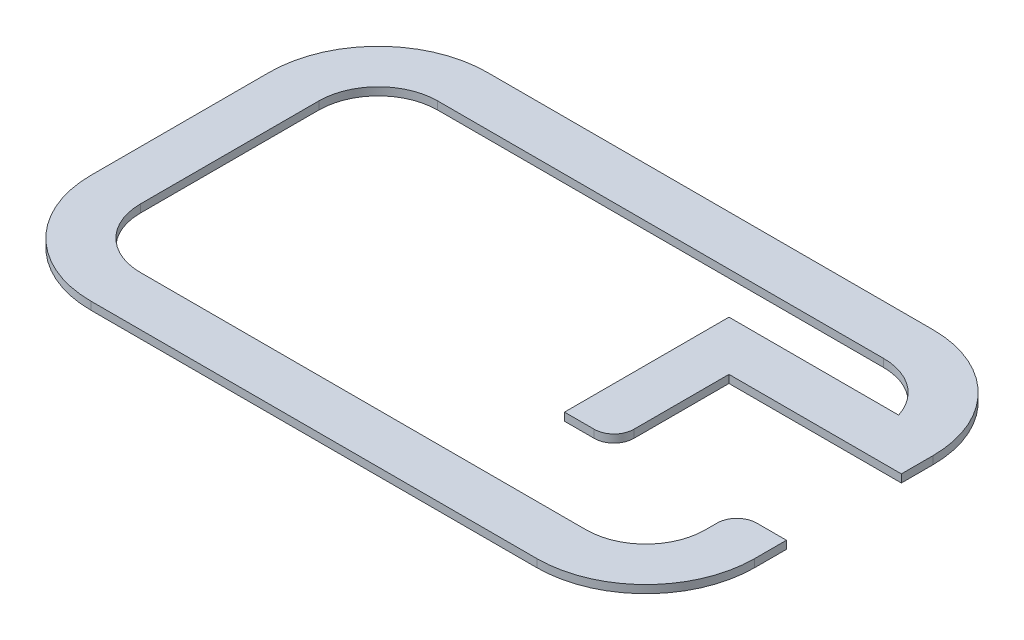
ISO-10303-21;
HEADER;
FILE_DESCRIPTION(('STEP AP214'),'2;1');
FILE_NAME('part.step','',(''),(''),'','','');
FILE_SCHEMA(('AUTOMOTIVE_DESIGN { 1 0 10303 214 1 1 1 1 }'));
ENDSEC;
DATA;
#1=APPLICATION_CONTEXT('core data for automotive mechanical design processes');
#2=APPLICATION_PROTOCOL_DEFINITION('international standard','automotive_design',2000,#1);
#3=PRODUCT_CONTEXT('',#1,'mechanical');
#4=PRODUCT('Part','Part','',(#3));
#5=PRODUCT_RELATED_PRODUCT_CATEGORY('part','',(#4));
#6=PRODUCT_DEFINITION_FORMATION('','',#4);
#7=PRODUCT_DEFINITION_CONTEXT('part definition',#1,'design');
#8=PRODUCT_DEFINITION('design','',#6,#7);
#9=PRODUCT_DEFINITION_SHAPE('','',#8);
#10=(LENGTH_UNIT() NAMED_UNIT(*) SI_UNIT(.MILLI.,.METRE.));
#11=(NAMED_UNIT(*) PLANE_ANGLE_UNIT() SI_UNIT($,.RADIAN.));
#12=(NAMED_UNIT(*) SI_UNIT($,.STERADIAN.) SOLID_ANGLE_UNIT());
#13=UNCERTAINTY_MEASURE_WITH_UNIT(LENGTH_MEASURE(1.E-05),#10,'distance_accuracy_value','');
#14=(GEOMETRIC_REPRESENTATION_CONTEXT(3) GLOBAL_UNCERTAINTY_ASSIGNED_CONTEXT((#13)) GLOBAL_UNIT_ASSIGNED_CONTEXT((#10,
#11,#12)) REPRESENTATION_CONTEXT('',''));
#15=CARTESIAN_POINT('',(0.,0.,0.));
#16=DIRECTION('',(0.,0.,1.));
#17=DIRECTION('',(1.,0.,0.));
#18=AXIS2_PLACEMENT_3D('',#15,#16,#17);
#19=CARTESIAN_POINT('',(55.,4.,-55.));
#20=DIRECTION('',(0.,-1.,0.));
#21=DIRECTION('',(0.,0.,-1.));
#22=AXIS2_PLACEMENT_3D('',#19,#20,#21);
#23=CYLINDRICAL_SURFACE('',#22,55.);
#24=CARTESIAN_POINT('',(55.,0.,-55.));
#25=DIRECTION('',(0.,1.,0.));
#26=DIRECTION('',(0.,0.,-1.));
#27=AXIS2_PLACEMENT_3D('',#24,#25,#26);
#28=CIRCLE('',#27,55.);
#29=CARTESIAN_POINT('',(0.,0.,-55.0000000000004));
#30=VERTEX_POINT('',#29);
#31=CARTESIAN_POINT('',(55.0000000000004,0.,0.));
#32=VERTEX_POINT('',#31);
#33=EDGE_CURVE('E230',#30,#32,#28,.T.);
#34=ORIENTED_EDGE('',*,*,#33,.T.);
#35=DIRECTION('',(0.,-1.,0.));
#36=VECTOR('',#35,1.);
#37=CARTESIAN_POINT('',(55.0000000000004,4.,0.));
#38=LINE('',#37,#36);
#39=CARTESIAN_POINT('',(55.0000000000004,4.,0.));
#40=VERTEX_POINT('',#39);
#41=EDGE_CURVE('E11',#40,#32,#38,.T.);
#42=ORIENTED_EDGE('',*,*,#41,.F.);
#43=CARTESIAN_POINT('',(55.,4.,-55.));
#44=DIRECTION('',(0.,1.,0.));
#45=DIRECTION('',(0.,0.,-1.));
#46=AXIS2_PLACEMENT_3D('',#43,#44,#45);
#47=CIRCLE('',#46,55.);
#48=CARTESIAN_POINT('',(0.,4.,-55.0000000000004));
#49=VERTEX_POINT('',#48);
#50=EDGE_CURVE('E278',#49,#40,#47,.T.);
#51=ORIENTED_EDGE('',*,*,#50,.F.);
#52=DIRECTION('',(0.,-1.,0.));
#53=VECTOR('',#52,1.);
#54=CARTESIAN_POINT('',(0.,4.,-55.0000000000004));
#55=LINE('',#54,#53);
#56=EDGE_CURVE('E226',#49,#30,#55,.T.);
#57=ORIENTED_EDGE('',*,*,#56,.T.);
#58=EDGE_LOOP('',(#34,#42,#51,#57));
#59=FACE_BOUND('',#58,.T.);
#60=ADVANCED_FACE('F32',(#59),#23,.T.);
#61=CARTESIAN_POINT('',(55.0000000000004,4.,0.));
#62=DIRECTION('',(0.,0.,-1.));
#63=DIRECTION('',(-1.,0.,0.));
#64=AXIS2_PLACEMENT_3D('',#61,#62,#63);
#65=PLANE('',#64);
#66=DIRECTION('',(1.,0.,0.));
#67=VECTOR('',#66,1.);
#68=CARTESIAN_POINT('',(55.0000000000004,0.,0.));
#69=LINE('',#68,#67);
#70=CARTESIAN_POINT('',(280.,0.,0.));
#71=VERTEX_POINT('',#70);
#72=EDGE_CURVE('E233',#32,#71,#69,.T.);
#73=ORIENTED_EDGE('',*,*,#72,.T.);
#74=DIRECTION('',(0.,-1.,0.));
#75=VECTOR('',#74,1.);
#76=CARTESIAN_POINT('',(280.,4.,0.));
#77=LINE('',#76,#75);
#78=CARTESIAN_POINT('',(280.,4.,0.));
#79=VERTEX_POINT('',#78);
#80=EDGE_CURVE('E40',#79,#71,#77,.T.);
#81=ORIENTED_EDGE('',*,*,#80,.F.);
#82=DIRECTION('',(1.,0.,0.));
#83=VECTOR('',#82,1.);
#84=CARTESIAN_POINT('',(55.0000000000004,4.,0.));
#85=LINE('',#84,#83);
#86=EDGE_CURVE('E142',#40,#79,#85,.T.);
#87=ORIENTED_EDGE('',*,*,#86,.F.);
#88=ORIENTED_EDGE('',*,*,#41,.T.);
#89=EDGE_LOOP('',(#73,#81,#87,#88));
#90=FACE_BOUND('',#89,.T.);
#91=ADVANCED_FACE('F421',(#90),#65,.F.);
#92=CARTESIAN_POINT('',(280.,4.,-55.));
#93=DIRECTION('',(0.,-1.,0.));
#94=DIRECTION('',(0.,0.,-1.));
#95=AXIS2_PLACEMENT_3D('',#92,#93,#94);
#96=CYLINDRICAL_SURFACE('',#95,55.);
#97=CARTESIAN_POINT('',(280.,0.,-55.));
#98=DIRECTION('',(0.,1.,0.));
#99=DIRECTION('',(0.,0.,1.));
#100=AXIS2_PLACEMENT_3D('',#97,#98,#99);
#101=CIRCLE('',#100,55.);
#102=CARTESIAN_POINT('',(335.,0.,-55.0000000000004));
#103=VERTEX_POINT('',#102);
#104=EDGE_CURVE('E235',#71,#103,#101,.T.);
#105=ORIENTED_EDGE('',*,*,#104,.T.);
#106=DIRECTION('',(0.,-1.,0.));
#107=VECTOR('',#106,1.);
#108=CARTESIAN_POINT('',(335.,4.,-55.0000000000004));
#109=LINE('',#108,#107);
#110=CARTESIAN_POINT('',(335.,4.,-55.0000000000004));
#111=VERTEX_POINT('',#110);
#112=EDGE_CURVE('E336',#111,#103,#109,.T.);
#113=ORIENTED_EDGE('',*,*,#112,.F.);
#114=CARTESIAN_POINT('',(280.,4.,-55.));
#115=DIRECTION('',(0.,1.,0.));
#116=DIRECTION('',(0.,0.,1.));
#117=AXIS2_PLACEMENT_3D('',#114,#115,#116);
#118=CIRCLE('',#117,55.);
#119=EDGE_CURVE('E344',#79,#111,#118,.T.);
#120=ORIENTED_EDGE('',*,*,#119,.F.);
#121=ORIENTED_EDGE('',*,*,#80,.T.);
#122=EDGE_LOOP('',(#105,#113,#120,#121));
#123=FACE_BOUND('',#122,.T.);
#124=ADVANCED_FACE('F342',(#123),#96,.T.);
#125=CARTESIAN_POINT('',(335.,4.,-55.0000000000004));
#126=DIRECTION('',(-1.,0.,0.));
#127=DIRECTION('',(0.,0.,1.));
#128=AXIS2_PLACEMENT_3D('',#125,#126,#127);
#129=PLANE('',#128);
#130=DIRECTION('',(0.,0.,-1.));
#131=VECTOR('',#130,1.);
#132=CARTESIAN_POINT('',(335.,0.,-55.0000000000004));
#133=LINE('',#132,#131);
#134=CARTESIAN_POINT('',(335.,0.,-71.));
#135=VERTEX_POINT('',#134);
#136=EDGE_CURVE('E237',#103,#135,#133,.T.);
#137=ORIENTED_EDGE('',*,*,#136,.T.);
#138=DIRECTION('',(0.,-1.,0.));
#139=VECTOR('',#138,1.);
#140=CARTESIAN_POINT('',(335.,4.,-71.));
#141=LINE('',#140,#139);
#142=CARTESIAN_POINT('',(335.,4.,-71.));
#143=VERTEX_POINT('',#142);
#144=EDGE_CURVE('E333',#143,#135,#141,.T.);
#145=ORIENTED_EDGE('',*,*,#144,.F.);
#146=DIRECTION('',(0.,0.,-1.));
#147=VECTOR('',#146,1.);
#148=CARTESIAN_POINT('',(335.,4.,-55.0000000000004));
#149=LINE('',#148,#147);
#150=EDGE_CURVE('E362',#111,#143,#149,.T.);
#151=ORIENTED_EDGE('',*,*,#150,.F.);
#152=ORIENTED_EDGE('',*,*,#112,.T.);
#153=EDGE_LOOP('',(#137,#145,#151,#152));
#154=FACE_BOUND('',#153,.T.);
#155=ADVANCED_FACE('F353',(#154),#129,.F.);
#156=CARTESIAN_POINT('',(320.,4.,-71.));
#157=DIRECTION('',(0.,0.,1.));
#158=DIRECTION('',(1.,0.,0.));
#159=AXIS2_PLACEMENT_3D('',#156,#157,#158);
#160=PLANE('',#159);
#161=DIRECTION('',(-1.,0.,0.));
#162=VECTOR('',#161,1.);
#163=CARTESIAN_POINT('',(320.,0.,-71.));
#164=LINE('',#163,#162);
#165=CARTESIAN_POINT('',(320.,0.,-71.));
#166=VERTEX_POINT('',#165);
#167=EDGE_CURVE('E239',#135,#166,#164,.T.);
#168=ORIENTED_EDGE('',*,*,#167,.T.);
#169=DIRECTION('',(0.,-1.,0.));
#170=VECTOR('',#169,1.);
#171=CARTESIAN_POINT('',(320.,4.,-71.));
#172=LINE('',#171,#170);
#173=CARTESIAN_POINT('',(320.,4.,-71.));
#174=VERTEX_POINT('',#173);
#175=EDGE_CURVE('E330',#174,#166,#172,.T.);
#176=ORIENTED_EDGE('',*,*,#175,.F.);
#177=DIRECTION('',(-1.,0.,0.));
#178=VECTOR('',#177,1.);
#179=CARTESIAN_POINT('',(320.,4.,-71.));
#180=LINE('',#179,#178);
#181=EDGE_CURVE('E359',#143,#174,#180,.T.);
#182=ORIENTED_EDGE('',*,*,#181,.F.);
#183=ORIENTED_EDGE('',*,*,#144,.T.);
#184=EDGE_LOOP('',(#168,#176,#182,#183));
#185=FACE_BOUND('',#184,.T.);
#186=ADVANCED_FACE('F357',(#185),#160,.F.);
#187=CARTESIAN_POINT('',(320.,4.,-61.));
#188=DIRECTION('',(0.,-1.,0.));
#189=DIRECTION('',(0.,0.,-1.));
#190=AXIS2_PLACEMENT_3D('',#187,#188,#189);
#191=CYLINDRICAL_SURFACE('',#190,10.);
#192=CARTESIAN_POINT('',(320.,0.,-61.));
#193=DIRECTION('',(0.,1.,0.));
#194=DIRECTION('',(0.,0.,-1.));
#195=AXIS2_PLACEMENT_3D('',#192,#193,#194);
#196=CIRCLE('',#195,10.);
#197=CARTESIAN_POINT('',(310.,0.,-60.9999999999999));
#198=VERTEX_POINT('',#197);
#199=EDGE_CURVE('E241',#166,#198,#196,.T.);
#200=ORIENTED_EDGE('',*,*,#199,.T.);
#201=DIRECTION('',(0.,-1.,0.));
#202=VECTOR('',#201,1.);
#203=CARTESIAN_POINT('',(310.,4.,-60.9999999999999));
#204=LINE('',#203,#202);
#205=CARTESIAN_POINT('',(310.,4.,-60.9999999999999));
#206=VERTEX_POINT('',#205);
#207=EDGE_CURVE('E327',#206,#198,#204,.T.);
#208=ORIENTED_EDGE('',*,*,#207,.F.);
#209=CARTESIAN_POINT('',(320.,4.,-61.));
#210=DIRECTION('',(0.,1.,0.));
#211=DIRECTION('',(0.,0.,-1.));
#212=AXIS2_PLACEMENT_3D('',#209,#210,#211);
#213=CIRCLE('',#212,10.);
#214=EDGE_CURVE('E361',#174,#206,#213,.T.);
#215=ORIENTED_EDGE('',*,*,#214,.F.);
#216=ORIENTED_EDGE('',*,*,#175,.T.);
#217=EDGE_LOOP('',(#200,#208,#215,#216));
#218=FACE_BOUND('',#217,.T.);
#219=ADVANCED_FACE('F434',(#218),#191,.T.);
#220=CARTESIAN_POINT('',(310.,4.,-55.0000000000002));
#221=DIRECTION('',(1.,0.,0.));
#222=DIRECTION('',(0.,0.,-1.));
#223=AXIS2_PLACEMENT_3D('',#220,#221,#222);
#224=PLANE('',#223);
#225=DIRECTION('',(0.,0.,1.));
#226=VECTOR('',#225,1.);
#227=CARTESIAN_POINT('',(310.,0.,-55.0000000000002));
#228=LINE('',#227,#226);
#229=CARTESIAN_POINT('',(310.,0.,-55.0000000000002));
#230=VERTEX_POINT('',#229);
#231=EDGE_CURVE('E243',#198,#230,#228,.T.);
#232=ORIENTED_EDGE('',*,*,#231,.T.);
#233=DIRECTION('',(0.,-1.,0.));
#234=VECTOR('',#233,1.);
#235=CARTESIAN_POINT('',(310.,4.,-55.0000000000002));
#236=LINE('',#235,#234);
#237=CARTESIAN_POINT('',(310.,4.,-55.0000000000002));
#238=VERTEX_POINT('',#237);
#239=EDGE_CURVE('E324',#238,#230,#236,.T.);
#240=ORIENTED_EDGE('',*,*,#239,.F.);
#241=DIRECTION('',(0.,0.,1.));
#242=VECTOR('',#241,1.);
#243=CARTESIAN_POINT('',(310.,4.,-55.0000000000002));
#244=LINE('',#243,#242);
#245=EDGE_CURVE('E364',#206,#238,#244,.T.);
#246=ORIENTED_EDGE('',*,*,#245,.F.);
#247=ORIENTED_EDGE('',*,*,#207,.T.);
#248=EDGE_LOOP('',(#232,#240,#246,#247));
#249=FACE_BOUND('',#248,.T.);
#250=ADVANCED_FACE('F437',(#249),#224,.F.);
#251=CARTESIAN_POINT('',(280.,4.,-55.));
#252=DIRECTION('',(0.,-1.,0.));
#253=DIRECTION('',(0.,0.,-1.));
#254=AXIS2_PLACEMENT_3D('',#251,#252,#253);
#255=CYLINDRICAL_SURFACE('',#254,30.);
#256=CARTESIAN_POINT('',(280.,0.,-55.));
#257=DIRECTION('',(0.,-1.,0.));
#258=DIRECTION('',(0.,0.,1.));
#259=AXIS2_PLACEMENT_3D('',#256,#257,#258);
#260=CIRCLE('',#259,30.);
#261=CARTESIAN_POINT('',(280.,0.,-25.));
#262=VERTEX_POINT('',#261);
#263=EDGE_CURVE('E245',#230,#262,#260,.T.);
#264=ORIENTED_EDGE('',*,*,#263,.T.);
#265=DIRECTION('',(0.,-1.,0.));
#266=VECTOR('',#265,1.);
#267=CARTESIAN_POINT('',(280.,4.,-25.));
#268=LINE('',#267,#266);
#269=CARTESIAN_POINT('',(280.,4.,-25.));
#270=VERTEX_POINT('',#269);
#271=EDGE_CURVE('E321',#270,#262,#268,.T.);
#272=ORIENTED_EDGE('',*,*,#271,.F.);
#273=CARTESIAN_POINT('',(280.,4.,-55.));
#274=DIRECTION('',(0.,-1.,0.));
#275=DIRECTION('',(0.,0.,1.));
#276=AXIS2_PLACEMENT_3D('',#273,#274,#275);
#277=CIRCLE('',#276,30.);
#278=EDGE_CURVE('E370',#238,#270,#277,.T.);
#279=ORIENTED_EDGE('',*,*,#278,.F.);
#280=ORIENTED_EDGE('',*,*,#239,.T.);
#281=EDGE_LOOP('',(#264,#272,#279,#280));
#282=FACE_BOUND('',#281,.T.);
#283=ADVANCED_FACE('F441',(#282),#255,.F.);
#284=CARTESIAN_POINT('',(55.0000000000002,4.,-25.));
#285=DIRECTION('',(0.,0.,1.));
#286=DIRECTION('',(1.,0.,0.));
#287=AXIS2_PLACEMENT_3D('',#284,#285,#286);
#288=PLANE('',#287);
#289=DIRECTION('',(-1.,0.,0.));
#290=VECTOR('',#289,1.);
#291=CARTESIAN_POINT('',(55.0000000000002,0.,-25.));
#292=LINE('',#291,#290);
#293=CARTESIAN_POINT('',(55.0000000000002,0.,-25.));
#294=VERTEX_POINT('',#293);
#295=EDGE_CURVE('E247',#262,#294,#292,.T.);
#296=ORIENTED_EDGE('',*,*,#295,.T.);
#297=DIRECTION('',(0.,-1.,0.));
#298=VECTOR('',#297,1.);
#299=CARTESIAN_POINT('',(55.0000000000002,4.,-25.));
#300=LINE('',#299,#298);
#301=CARTESIAN_POINT('',(55.0000000000002,4.,-25.));
#302=VERTEX_POINT('',#301);
#303=EDGE_CURVE('E318',#302,#294,#300,.T.);
#304=ORIENTED_EDGE('',*,*,#303,.F.);
#305=DIRECTION('',(-1.,0.,0.));
#306=VECTOR('',#305,1.);
#307=CARTESIAN_POINT('',(55.0000000000002,4.,-25.));
#308=LINE('',#307,#306);
#309=EDGE_CURVE('E372',#270,#302,#308,.T.);
#310=ORIENTED_EDGE('',*,*,#309,.F.);
#311=ORIENTED_EDGE('',*,*,#271,.T.);
#312=EDGE_LOOP('',(#296,#304,#310,#311));
#313=FACE_BOUND('',#312,.T.);
#314=ADVANCED_FACE('F445',(#313),#288,.F.);
#315=CARTESIAN_POINT('',(55.,4.,-55.));
#316=DIRECTION('',(0.,-1.,0.));
#317=DIRECTION('',(0.,0.,-1.));
#318=AXIS2_PLACEMENT_3D('',#315,#316,#317);
#319=CYLINDRICAL_SURFACE('',#318,30.);
#320=CARTESIAN_POINT('',(55.,0.,-55.));
#321=DIRECTION('',(0.,-1.,0.));
#322=DIRECTION('',(0.,0.,-1.));
#323=AXIS2_PLACEMENT_3D('',#320,#321,#322);
#324=CIRCLE('',#323,30.);
#325=CARTESIAN_POINT('',(25.,0.,-55.0000000000004));
#326=VERTEX_POINT('',#325);
#327=EDGE_CURVE('E249',#294,#326,#324,.T.);
#328=ORIENTED_EDGE('',*,*,#327,.T.);
#329=DIRECTION('',(0.,-1.,0.));
#330=VECTOR('',#329,1.);
#331=CARTESIAN_POINT('',(25.,4.,-55.0000000000004));
#332=LINE('',#331,#330);
#333=CARTESIAN_POINT('',(25.,4.,-55.0000000000004));
#334=VERTEX_POINT('',#333);
#335=EDGE_CURVE('E315',#334,#326,#332,.T.);
#336=ORIENTED_EDGE('',*,*,#335,.F.);
#337=CARTESIAN_POINT('',(55.,4.,-55.));
#338=DIRECTION('',(0.,-1.,0.));
#339=DIRECTION('',(0.,0.,-1.));
#340=AXIS2_PLACEMENT_3D('',#337,#338,#339);
#341=CIRCLE('',#340,30.);
#342=EDGE_CURVE('E374',#302,#334,#341,.T.);
#343=ORIENTED_EDGE('',*,*,#342,.F.);
#344=ORIENTED_EDGE('',*,*,#303,.T.);
#345=EDGE_LOOP('',(#328,#336,#343,#344));
#346=FACE_BOUND('',#345,.T.);
#347=ADVANCED_FACE('F449',(#346),#319,.F.);
#348=CARTESIAN_POINT('',(25.,4.,-55.0000000000004));
#349=DIRECTION('',(-1.,0.,0.));
#350=DIRECTION('',(0.,0.,1.));
#351=AXIS2_PLACEMENT_3D('',#348,#349,#350);
#352=PLANE('',#351);
#353=DIRECTION('',(0.,0.,-1.));
#354=VECTOR('',#353,1.);
#355=CARTESIAN_POINT('',(25.,0.,-55.0000000000004));
#356=LINE('',#355,#354);
#357=CARTESIAN_POINT('',(25.,0.,-145.));
#358=VERTEX_POINT('',#357);
#359=EDGE_CURVE('E251',#326,#358,#356,.T.);
#360=ORIENTED_EDGE('',*,*,#359,.T.);
#361=DIRECTION('',(0.,-1.,0.));
#362=VECTOR('',#361,1.);
#363=CARTESIAN_POINT('',(25.,4.,-145.));
#364=LINE('',#363,#362);
#365=CARTESIAN_POINT('',(25.,4.,-145.));
#366=VERTEX_POINT('',#365);
#367=EDGE_CURVE('E312',#366,#358,#364,.T.);
#368=ORIENTED_EDGE('',*,*,#367,.F.);
#369=DIRECTION('',(0.,0.,-1.));
#370=VECTOR('',#369,1.);
#371=CARTESIAN_POINT('',(25.,4.,-55.0000000000004));
#372=LINE('',#371,#370);
#373=EDGE_CURVE('E376',#334,#366,#372,.T.);
#374=ORIENTED_EDGE('',*,*,#373,.F.);
#375=ORIENTED_EDGE('',*,*,#335,.T.);
#376=EDGE_LOOP('',(#360,#368,#374,#375));
#377=FACE_BOUND('',#376,.T.);
#378=ADVANCED_FACE('F453',(#377),#352,.F.);
#379=CARTESIAN_POINT('',(55.,4.,-145.));
#380=DIRECTION('',(0.,-1.,0.));
#381=DIRECTION('',(0.,0.,-1.));
#382=AXIS2_PLACEMENT_3D('',#379,#380,#381);
#383=CYLINDRICAL_SURFACE('',#382,30.);
#384=CARTESIAN_POINT('',(55.,0.,-145.));
#385=DIRECTION('',(0.,-1.,0.));
#386=DIRECTION('',(0.,0.,-1.));
#387=AXIS2_PLACEMENT_3D('',#384,#385,#386);
#388=CIRCLE('',#387,30.);
#389=CARTESIAN_POINT('',(55.,0.,-175.));
#390=VERTEX_POINT('',#389);
#391=EDGE_CURVE('E253',#358,#390,#388,.T.);
#392=ORIENTED_EDGE('',*,*,#391,.T.);
#393=DIRECTION('',(0.,-1.,0.));
#394=VECTOR('',#393,1.);
#395=CARTESIAN_POINT('',(55.,4.,-175.));
#396=LINE('',#395,#394);
#397=CARTESIAN_POINT('',(55.,4.,-175.));
#398=VERTEX_POINT('',#397);
#399=EDGE_CURVE('E309',#398,#390,#396,.T.);
#400=ORIENTED_EDGE('',*,*,#399,.F.);
#401=CARTESIAN_POINT('',(55.,4.,-145.));
#402=DIRECTION('',(0.,-1.,0.));
#403=DIRECTION('',(0.,0.,-1.));
#404=AXIS2_PLACEMENT_3D('',#401,#402,#403);
#405=CIRCLE('',#404,30.);
#406=EDGE_CURVE('E378',#366,#398,#405,.T.);
#407=ORIENTED_EDGE('',*,*,#406,.F.);
#408=ORIENTED_EDGE('',*,*,#367,.T.);
#409=EDGE_LOOP('',(#392,#400,#407,#408));
#410=FACE_BOUND('',#409,.T.);
#411=ADVANCED_FACE('F457',(#410),#383,.F.);
#412=CARTESIAN_POINT('',(55.0000000000004,4.,-175.));
#413=DIRECTION('',(0.,0.,-1.));
#414=DIRECTION('',(-1.,0.,0.));
#415=AXIS2_PLACEMENT_3D('',#412,#413,#414);
#416=PLANE('',#415);
#417=DIRECTION('',(1.,0.,0.));
#418=VECTOR('',#417,1.);
#419=CARTESIAN_POINT('',(55.0000000000004,0.,-175.));
#420=LINE('',#419,#418);
#421=CARTESIAN_POINT('',(280.,0.,-175.));
#422=VERTEX_POINT('',#421);
#423=EDGE_CURVE('E255',#390,#422,#420,.T.);
#424=ORIENTED_EDGE('',*,*,#423,.T.);
#425=DIRECTION('',(0.,-1.,0.));
#426=VECTOR('',#425,1.);
#427=CARTESIAN_POINT('',(280.,4.,-175.));
#428=LINE('',#427,#426);
#429=CARTESIAN_POINT('',(280.,4.,-175.));
#430=VERTEX_POINT('',#429);
#431=EDGE_CURVE('E306',#430,#422,#428,.T.);
#432=ORIENTED_EDGE('',*,*,#431,.F.);
#433=DIRECTION('',(1.,0.,0.));
#434=VECTOR('',#433,1.);
#435=CARTESIAN_POINT('',(55.0000000000004,4.,-175.));
#436=LINE('',#435,#434);
#437=EDGE_CURVE('E380',#398,#430,#436,.T.);
#438=ORIENTED_EDGE('',*,*,#437,.F.);
#439=ORIENTED_EDGE('',*,*,#399,.T.);
#440=EDGE_LOOP('',(#424,#432,#438,#439));
#441=FACE_BOUND('',#440,.T.);
#442=ADVANCED_FACE('F461',(#441),#416,.F.);
#443=CARTESIAN_POINT('',(280.,4.,-145.));
#444=DIRECTION('',(0.,-1.,0.));
#445=DIRECTION('',(0.,0.,-1.));
#446=AXIS2_PLACEMENT_3D('',#443,#444,#445);
#447=CYLINDRICAL_SURFACE('',#446,30.);
#448=CARTESIAN_POINT('',(280.,0.,-145.));
#449=DIRECTION('',(0.,-1.,0.));
#450=DIRECTION('',(0.,0.,-1.));
#451=AXIS2_PLACEMENT_3D('',#448,#449,#450);
#452=CIRCLE('',#451,30.);
#453=CARTESIAN_POINT('',(308.618176042508,0.,-154.));
#454=VERTEX_POINT('',#453);
#455=EDGE_CURVE('E257',#422,#454,#452,.T.);
#456=ORIENTED_EDGE('',*,*,#455,.T.);
#457=DIRECTION('',(0.,-1.,0.));
#458=VECTOR('',#457,1.);
#459=CARTESIAN_POINT('',(308.618176042508,4.,-154.));
#460=LINE('',#459,#458);
#461=CARTESIAN_POINT('',(308.618176042508,4.,-154.));
#462=VERTEX_POINT('',#461);
#463=EDGE_CURVE('E303',#462,#454,#460,.T.);
#464=ORIENTED_EDGE('',*,*,#463,.F.);
#465=CARTESIAN_POINT('',(280.,4.,-145.));
#466=DIRECTION('',(0.,-1.,0.));
#467=DIRECTION('',(0.,0.,-1.));
#468=AXIS2_PLACEMENT_3D('',#465,#466,#467);
#469=CIRCLE('',#468,30.);
#470=EDGE_CURVE('E382',#430,#462,#469,.T.);
#471=ORIENTED_EDGE('',*,*,#470,.F.);
#472=ORIENTED_EDGE('',*,*,#431,.T.);
#473=EDGE_LOOP('',(#456,#464,#471,#472));
#474=FACE_BOUND('',#473,.T.);
#475=ADVANCED_FACE('F465',(#474),#447,.F.);
#476=CARTESIAN_POINT('',(308.618176042508,4.,-154.));
#477=DIRECTION('',(0.,0.,1.));
#478=DIRECTION('',(1.,0.,0.));
#479=AXIS2_PLACEMENT_3D('',#476,#477,#478);
#480=PLANE('',#479);
#481=DIRECTION('',(-1.,0.,0.));
#482=VECTOR('',#481,1.);
#483=CARTESIAN_POINT('',(308.618176042508,0.,-154.));
#484=LINE('',#483,#482);
#485=CARTESIAN_POINT('',(223.,0.,-154.));
#486=VERTEX_POINT('',#485);
#487=EDGE_CURVE('E259',#454,#486,#484,.T.);
#488=ORIENTED_EDGE('',*,*,#487,.T.);
#489=DIRECTION('',(0.,-1.,0.));
#490=VECTOR('',#489,1.);
#491=CARTESIAN_POINT('',(223.,4.,-154.));
#492=LINE('',#491,#490);
#493=CARTESIAN_POINT('',(223.,4.,-154.));
#494=VERTEX_POINT('',#493);
#495=EDGE_CURVE('E300',#494,#486,#492,.T.);
#496=ORIENTED_EDGE('',*,*,#495,.F.);
#497=DIRECTION('',(-1.,0.,0.));
#498=VECTOR('',#497,1.);
#499=CARTESIAN_POINT('',(308.618176042508,4.,-154.));
#500=LINE('',#499,#498);
#501=EDGE_CURVE('E384',#462,#494,#500,.T.);
#502=ORIENTED_EDGE('',*,*,#501,.F.);
#503=ORIENTED_EDGE('',*,*,#463,.T.);
#504=EDGE_LOOP('',(#488,#496,#502,#503));
#505=FACE_BOUND('',#504,.T.);
#506=ADVANCED_FACE('F469',(#505),#480,.F.);
#507=CARTESIAN_POINT('',(223.,4.,-154.));
#508=DIRECTION('',(1.,0.,0.));
#509=DIRECTION('',(0.,0.,-1.));
#510=AXIS2_PLACEMENT_3D('',#507,#508,#509);
#511=PLANE('',#510);
#512=DIRECTION('',(0.,0.,1.));
#513=VECTOR('',#512,1.);
#514=CARTESIAN_POINT('',(223.,0.,-154.));
#515=LINE('',#514,#513);
#516=CARTESIAN_POINT('',(223.,0.,-70.9999999999996));
#517=VERTEX_POINT('',#516);
#518=EDGE_CURVE('E261',#486,#517,#515,.T.);
#519=ORIENTED_EDGE('',*,*,#518,.T.);
#520=DIRECTION('',(0.,-1.,0.));
#521=VECTOR('',#520,1.);
#522=CARTESIAN_POINT('',(223.,4.,-70.9999999999996));
#523=LINE('',#522,#521);
#524=CARTESIAN_POINT('',(223.,4.,-70.9999999999996));
#525=VERTEX_POINT('',#524);
#526=EDGE_CURVE('E297',#525,#517,#523,.T.);
#527=ORIENTED_EDGE('',*,*,#526,.F.);
#528=DIRECTION('',(0.,0.,1.));
#529=VECTOR('',#528,1.);
#530=CARTESIAN_POINT('',(223.,4.,-154.));
#531=LINE('',#530,#529);
#532=EDGE_CURVE('E386',#494,#525,#531,.T.);
#533=ORIENTED_EDGE('',*,*,#532,.F.);
#534=ORIENTED_EDGE('',*,*,#495,.T.);
#535=EDGE_LOOP('',(#519,#527,#533,#534));
#536=FACE_BOUND('',#535,.T.);
#537=ADVANCED_FACE('F473',(#536),#511,.F.);
#538=CARTESIAN_POINT('',(223.,4.,-70.9999999999996));
#539=DIRECTION('',(0.,0.,-1.));
#540=DIRECTION('',(-1.,0.,0.));
#541=AXIS2_PLACEMENT_3D('',#538,#539,#540);
#542=PLANE('',#541);
#543=DIRECTION('',(1.,0.,0.));
#544=VECTOR('',#543,1.);
#545=CARTESIAN_POINT('',(223.,0.,-70.9999999999996));
#546=LINE('',#545,#544);
#547=CARTESIAN_POINT('',(238.,0.,-70.9999999999996));
#548=VERTEX_POINT('',#547);
#549=EDGE_CURVE('E263',#517,#548,#546,.T.);
#550=ORIENTED_EDGE('',*,*,#549,.T.);
#551=DIRECTION('',(0.,-1.,0.));
#552=VECTOR('',#551,1.);
#553=CARTESIAN_POINT('',(238.,4.,-70.9999999999996));
#554=LINE('',#553,#552);
#555=CARTESIAN_POINT('',(238.,4.,-70.9999999999996));
#556=VERTEX_POINT('',#555);
#557=EDGE_CURVE('E294',#556,#548,#554,.T.);
#558=ORIENTED_EDGE('',*,*,#557,.F.);
#559=DIRECTION('',(1.,0.,0.));
#560=VECTOR('',#559,1.);
#561=CARTESIAN_POINT('',(223.,4.,-70.9999999999996));
#562=LINE('',#561,#560);
#563=EDGE_CURVE('E388',#525,#556,#562,.T.);
#564=ORIENTED_EDGE('',*,*,#563,.F.);
#565=ORIENTED_EDGE('',*,*,#526,.T.);
#566=EDGE_LOOP('',(#550,#558,#564,#565));
#567=FACE_BOUND('',#566,.T.);
#568=ADVANCED_FACE('F477',(#567),#542,.F.);
#569=CARTESIAN_POINT('',(238.,4.,-80.9999999999996));
#570=DIRECTION('',(0.,-1.,0.));
#571=DIRECTION('',(0.,0.,-1.));
#572=AXIS2_PLACEMENT_3D('',#569,#570,#571);
#573=CYLINDRICAL_SURFACE('',#572,10.);
#574=CARTESIAN_POINT('',(238.,0.,-80.9999999999996));
#575=DIRECTION('',(0.,1.,0.));
#576=DIRECTION('',(0.,0.,-1.));
#577=AXIS2_PLACEMENT_3D('',#574,#575,#576);
#578=CIRCLE('',#577,10.);
#579=CARTESIAN_POINT('',(248.,0.,-80.9999999999997));
#580=VERTEX_POINT('',#579);
#581=EDGE_CURVE('E265',#548,#580,#578,.T.);
#582=ORIENTED_EDGE('',*,*,#581,.T.);
#583=DIRECTION('',(0.,-1.,0.));
#584=VECTOR('',#583,1.);
#585=CARTESIAN_POINT('',(248.,4.,-80.9999999999997));
#586=LINE('',#585,#584);
#587=CARTESIAN_POINT('',(248.,4.,-80.9999999999997));
#588=VERTEX_POINT('',#587);
#589=EDGE_CURVE('E291',#588,#580,#586,.T.);
#590=ORIENTED_EDGE('',*,*,#589,.F.);
#591=CARTESIAN_POINT('',(238.,4.,-80.9999999999996));
#592=DIRECTION('',(0.,1.,0.));
#593=DIRECTION('',(0.,0.,-1.));
#594=AXIS2_PLACEMENT_3D('',#591,#592,#593);
#595=CIRCLE('',#594,10.);
#596=EDGE_CURVE('E390',#556,#588,#595,.T.);
#597=ORIENTED_EDGE('',*,*,#596,.F.);
#598=ORIENTED_EDGE('',*,*,#557,.T.);
#599=EDGE_LOOP('',(#582,#590,#597,#598));
#600=FACE_BOUND('',#599,.T.);
#601=ADVANCED_FACE('F481',(#600),#573,.T.);
#602=CARTESIAN_POINT('',(248.,4.,-129.));
#603=DIRECTION('',(-1.,0.,0.));
#604=DIRECTION('',(0.,0.,1.));
#605=AXIS2_PLACEMENT_3D('',#602,#603,#604);
#606=PLANE('',#605);
#607=DIRECTION('',(0.,0.,-1.));
#608=VECTOR('',#607,1.);
#609=CARTESIAN_POINT('',(248.,0.,-129.));
#610=LINE('',#609,#608);
#611=CARTESIAN_POINT('',(248.,0.,-129.));
#612=VERTEX_POINT('',#611);
#613=EDGE_CURVE('E267',#580,#612,#610,.T.);
#614=ORIENTED_EDGE('',*,*,#613,.T.);
#615=DIRECTION('',(0.,-1.,0.));
#616=VECTOR('',#615,1.);
#617=CARTESIAN_POINT('',(248.,4.,-129.));
#618=LINE('',#617,#616);
#619=CARTESIAN_POINT('',(248.,4.,-129.));
#620=VERTEX_POINT('',#619);
#621=EDGE_CURVE('E288',#620,#612,#618,.T.);
#622=ORIENTED_EDGE('',*,*,#621,.F.);
#623=DIRECTION('',(0.,0.,-1.));
#624=VECTOR('',#623,1.);
#625=CARTESIAN_POINT('',(248.,4.,-129.));
#626=LINE('',#625,#624);
#627=EDGE_CURVE('E392',#588,#620,#626,.T.);
#628=ORIENTED_EDGE('',*,*,#627,.F.);
#629=ORIENTED_EDGE('',*,*,#589,.T.);
#630=EDGE_LOOP('',(#614,#622,#628,#629));
#631=FACE_BOUND('',#630,.T.);
#632=ADVANCED_FACE('F485',(#631),#606,.F.);
#633=CARTESIAN_POINT('',(335.,4.,-129.));
#634=DIRECTION('',(0.,0.,-1.));
#635=DIRECTION('',(-1.,0.,0.));
#636=AXIS2_PLACEMENT_3D('',#633,#634,#635);
#637=PLANE('',#636);
#638=DIRECTION('',(1.,0.,0.));
#639=VECTOR('',#638,1.);
#640=CARTESIAN_POINT('',(335.,0.,-129.));
#641=LINE('',#640,#639);
#642=CARTESIAN_POINT('',(335.,0.,-129.));
#643=VERTEX_POINT('',#642);
#644=EDGE_CURVE('E269',#612,#643,#641,.T.);
#645=ORIENTED_EDGE('',*,*,#644,.T.);
#646=DIRECTION('',(0.,-1.,0.));
#647=VECTOR('',#646,1.);
#648=CARTESIAN_POINT('',(335.,4.,-129.));
#649=LINE('',#648,#647);
#650=CARTESIAN_POINT('',(335.,4.,-129.));
#651=VERTEX_POINT('',#650);
#652=EDGE_CURVE('E285',#651,#643,#649,.T.);
#653=ORIENTED_EDGE('',*,*,#652,.F.);
#654=DIRECTION('',(1.,0.,0.));
#655=VECTOR('',#654,1.);
#656=CARTESIAN_POINT('',(335.,4.,-129.));
#657=LINE('',#656,#655);
#658=EDGE_CURVE('E394',#620,#651,#657,.T.);
#659=ORIENTED_EDGE('',*,*,#658,.F.);
#660=ORIENTED_EDGE('',*,*,#621,.T.);
#661=EDGE_LOOP('',(#645,#653,#659,#660));
#662=FACE_BOUND('',#661,.T.);
#663=ADVANCED_FACE('F489',(#662),#637,.F.);
#664=CARTESIAN_POINT('',(335.,4.,-145.));
#665=DIRECTION('',(-1.,0.,0.));
#666=DIRECTION('',(0.,0.,1.));
#667=AXIS2_PLACEMENT_3D('',#664,#665,#666);
#668=PLANE('',#667);
#669=DIRECTION('',(0.,0.,-1.));
#670=VECTOR('',#669,1.);
#671=CARTESIAN_POINT('',(335.,0.,-145.));
#672=LINE('',#671,#670);
#673=CARTESIAN_POINT('',(335.,0.,-145.));
#674=VERTEX_POINT('',#673);
#675=EDGE_CURVE('E271',#643,#674,#672,.T.);
#676=ORIENTED_EDGE('',*,*,#675,.T.);
#677=DIRECTION('',(0.,-1.,0.));
#678=VECTOR('',#677,1.);
#679=CARTESIAN_POINT('',(335.,4.,-145.));
#680=LINE('',#679,#678);
#681=CARTESIAN_POINT('',(335.,4.,-145.));
#682=VERTEX_POINT('',#681);
#683=EDGE_CURVE('E282',#682,#674,#680,.T.);
#684=ORIENTED_EDGE('',*,*,#683,.F.);
#685=DIRECTION('',(0.,0.,-1.));
#686=VECTOR('',#685,1.);
#687=CARTESIAN_POINT('',(335.,4.,-145.));
#688=LINE('',#687,#686);
#689=EDGE_CURVE('E396',#651,#682,#688,.T.);
#690=ORIENTED_EDGE('',*,*,#689,.F.);
#691=ORIENTED_EDGE('',*,*,#652,.T.);
#692=EDGE_LOOP('',(#676,#684,#690,#691));
#693=FACE_BOUND('',#692,.T.);
#694=ADVANCED_FACE('F402',(#693),#668,.F.);
#695=CARTESIAN_POINT('',(280.,4.,-145.));
#696=DIRECTION('',(0.,-1.,0.));
#697=DIRECTION('',(0.,0.,-1.));
#698=AXIS2_PLACEMENT_3D('',#695,#696,#697);
#699=CYLINDRICAL_SURFACE('',#698,55.);
#700=CARTESIAN_POINT('',(280.,0.,-145.));
#701=DIRECTION('',(0.,1.,0.));
#702=DIRECTION('',(0.,0.,-1.));
#703=AXIS2_PLACEMENT_3D('',#700,#701,#702);
#704=CIRCLE('',#703,55.);
#705=CARTESIAN_POINT('',(280.,0.,-200.));
#706=VERTEX_POINT('',#705);
#707=EDGE_CURVE('E273',#674,#706,#704,.T.);
#708=ORIENTED_EDGE('',*,*,#707,.T.);
#709=DIRECTION('',(0.,-1.,0.));
#710=VECTOR('',#709,1.);
#711=CARTESIAN_POINT('',(280.,4.,-200.));
#712=LINE('',#711,#710);
#713=CARTESIAN_POINT('',(280.,4.,-200.));
#714=VERTEX_POINT('',#713);
#715=EDGE_CURVE('E221',#714,#706,#712,.T.);
#716=ORIENTED_EDGE('',*,*,#715,.F.);
#717=CARTESIAN_POINT('',(280.,4.,-145.));
#718=DIRECTION('',(0.,1.,0.));
#719=DIRECTION('',(0.,0.,-1.));
#720=AXIS2_PLACEMENT_3D('',#717,#718,#719);
#721=CIRCLE('',#720,55.);
#722=EDGE_CURVE('E212',#682,#714,#721,.T.);
#723=ORIENTED_EDGE('',*,*,#722,.F.);
#724=ORIENTED_EDGE('',*,*,#683,.T.);
#725=EDGE_LOOP('',(#708,#716,#723,#724));
#726=FACE_BOUND('',#725,.T.);
#727=ADVANCED_FACE('F406',(#726),#699,.T.);
#728=CARTESIAN_POINT('',(55.0000000000004,4.,-200.));
#729=DIRECTION('',(0.,0.,1.));
#730=DIRECTION('',(1.,0.,0.));
#731=AXIS2_PLACEMENT_3D('',#728,#729,#730);
#732=PLANE('',#731);
#733=DIRECTION('',(-1.,0.,0.));
#734=VECTOR('',#733,1.);
#735=CARTESIAN_POINT('',(55.0000000000004,0.,-200.));
#736=LINE('',#735,#734);
#737=CARTESIAN_POINT('',(55.0000000000004,0.,-200.));
#738=VERTEX_POINT('',#737);
#739=EDGE_CURVE('E220',#706,#738,#736,.T.);
#740=ORIENTED_EDGE('',*,*,#739,.T.);
#741=DIRECTION('',(0.,-1.,0.));
#742=VECTOR('',#741,1.);
#743=CARTESIAN_POINT('',(55.0000000000004,4.,-200.));
#744=LINE('',#743,#742);
#745=CARTESIAN_POINT('',(55.0000000000004,4.,-200.));
#746=VERTEX_POINT('',#745);
#747=EDGE_CURVE('E217',#746,#738,#744,.T.);
#748=ORIENTED_EDGE('',*,*,#747,.F.);
#749=DIRECTION('',(-1.,0.,0.));
#750=VECTOR('',#749,1.);
#751=CARTESIAN_POINT('',(55.0000000000004,4.,-200.));
#752=LINE('',#751,#750);
#753=EDGE_CURVE('E206',#714,#746,#752,.T.);
#754=ORIENTED_EDGE('',*,*,#753,.F.);
#755=ORIENTED_EDGE('',*,*,#715,.T.);
#756=EDGE_LOOP('',(#740,#748,#754,#755));
#757=FACE_BOUND('',#756,.T.);
#758=ADVANCED_FACE('F218',(#757),#732,.F.);
#759=CARTESIAN_POINT('',(55.,4.,-145.));
#760=DIRECTION('',(0.,-1.,0.));
#761=DIRECTION('',(0.,0.,-1.));
#762=AXIS2_PLACEMENT_3D('',#759,#760,#761);
#763=CYLINDRICAL_SURFACE('',#762,55.);
#764=CARTESIAN_POINT('',(55.,0.,-145.));
#765=DIRECTION('',(0.,1.,0.));
#766=DIRECTION('',(0.,0.,-1.));
#767=AXIS2_PLACEMENT_3D('',#764,#765,#766);
#768=CIRCLE('',#767,55.);
#769=CARTESIAN_POINT('',(0.,0.,-145.));
#770=VERTEX_POINT('',#769);
#771=EDGE_CURVE('E128',#738,#770,#768,.T.);
#772=ORIENTED_EDGE('',*,*,#771,.T.);
#773=DIRECTION('',(0.,-1.,0.));
#774=VECTOR('',#773,1.);
#775=CARTESIAN_POINT('',(0.,4.,-145.));
#776=LINE('',#775,#774);
#777=CARTESIAN_POINT('',(0.,4.,-145.));
#778=VERTEX_POINT('',#777);
#779=EDGE_CURVE('E222',#778,#770,#776,.T.);
#780=ORIENTED_EDGE('',*,*,#779,.F.);
#781=CARTESIAN_POINT('',(55.,4.,-145.));
#782=DIRECTION('',(0.,1.,0.));
#783=DIRECTION('',(0.,0.,-1.));
#784=AXIS2_PLACEMENT_3D('',#781,#782,#783);
#785=CIRCLE('',#784,55.);
#786=EDGE_CURVE('E210',#746,#778,#785,.T.);
#787=ORIENTED_EDGE('',*,*,#786,.F.);
#788=ORIENTED_EDGE('',*,*,#747,.T.);
#789=EDGE_LOOP('',(#772,#780,#787,#788));
#790=FACE_BOUND('',#789,.T.);
#791=ADVANCED_FACE('F224',(#790),#763,.T.);
#792=CARTESIAN_POINT('',(0.,4.,-55.0000000000004));
#793=DIRECTION('',(1.,0.,0.));
#794=DIRECTION('',(0.,0.,-1.));
#795=AXIS2_PLACEMENT_3D('',#792,#793,#794);
#796=PLANE('',#795);
#797=DIRECTION('',(0.,0.,1.));
#798=VECTOR('',#797,1.);
#799=CARTESIAN_POINT('',(0.,0.,-55.0000000000004));
#800=LINE('',#799,#798);
#801=EDGE_CURVE('E134',#770,#30,#800,.T.);
#802=ORIENTED_EDGE('',*,*,#801,.T.);
#803=ORIENTED_EDGE('',*,*,#56,.F.);
#804=DIRECTION('',(0.,0.,1.));
#805=VECTOR('',#804,1.);
#806=CARTESIAN_POINT('',(0.,4.,-55.0000000000004));
#807=LINE('',#806,#805);
#808=EDGE_CURVE('E48',#778,#49,#807,.T.);
#809=ORIENTED_EDGE('',*,*,#808,.F.);
#810=ORIENTED_EDGE('',*,*,#779,.T.);
#811=EDGE_LOOP('',(#802,#803,#809,#810));
#812=FACE_BOUND('',#811,.T.);
#813=ADVANCED_FACE('F410',(#812),#796,.F.);
#814=CARTESIAN_POINT('',(55.,4.,-55.));
#815=DIRECTION('',(0.,-1.,0.));
#816=DIRECTION('',(0.,0.,-1.));
#817=AXIS2_PLACEMENT_3D('',#814,#815,#816);
#818=PLANE('',#817);
#819=ORIENTED_EDGE('',*,*,#50,.T.);
#820=ORIENTED_EDGE('',*,*,#86,.T.);
#821=ORIENTED_EDGE('',*,*,#119,.T.);
#822=ORIENTED_EDGE('',*,*,#150,.T.);
#823=ORIENTED_EDGE('',*,*,#181,.T.);
#824=ORIENTED_EDGE('',*,*,#214,.T.);
#825=ORIENTED_EDGE('',*,*,#245,.T.);
#826=ORIENTED_EDGE('',*,*,#278,.T.);
#827=ORIENTED_EDGE('',*,*,#309,.T.);
#828=ORIENTED_EDGE('',*,*,#342,.T.);
#829=ORIENTED_EDGE('',*,*,#373,.T.);
#830=ORIENTED_EDGE('',*,*,#406,.T.);
#831=ORIENTED_EDGE('',*,*,#437,.T.);
#832=ORIENTED_EDGE('',*,*,#470,.T.);
#833=ORIENTED_EDGE('',*,*,#501,.T.);
#834=ORIENTED_EDGE('',*,*,#532,.T.);
#835=ORIENTED_EDGE('',*,*,#563,.T.);
#836=ORIENTED_EDGE('',*,*,#596,.T.);
#837=ORIENTED_EDGE('',*,*,#627,.T.);
#838=ORIENTED_EDGE('',*,*,#658,.T.);
#839=ORIENTED_EDGE('',*,*,#689,.T.);
#840=ORIENTED_EDGE('',*,*,#722,.T.);
#841=ORIENTED_EDGE('',*,*,#753,.T.);
#842=ORIENTED_EDGE('',*,*,#786,.T.);
#843=ORIENTED_EDGE('',*,*,#808,.T.);
#844=EDGE_LOOP('',(#819,#820,#821,#822,#823,#824,#825,#826,#827,#828,#829,#830,#831,#832,#833,
#834,#835,#836,#837,#838,#839,#840,#841,#842,#843));
#845=FACE_BOUND('',#844,.T.);
#846=ADVANCED_FACE('F208',(#845),#818,.F.);
#847=CARTESIAN_POINT('',(55.,0.,-55.));
#848=DIRECTION('',(0.,-1.,0.));
#849=DIRECTION('',(0.,0.,-1.));
#850=AXIS2_PLACEMENT_3D('',#847,#848,#849);
#851=PLANE('',#850);
#852=ORIENTED_EDGE('',*,*,#33,.F.);
#853=ORIENTED_EDGE('',*,*,#801,.F.);
#854=ORIENTED_EDGE('',*,*,#771,.F.);
#855=ORIENTED_EDGE('',*,*,#739,.F.);
#856=ORIENTED_EDGE('',*,*,#707,.F.);
#857=ORIENTED_EDGE('',*,*,#675,.F.);
#858=ORIENTED_EDGE('',*,*,#644,.F.);
#859=ORIENTED_EDGE('',*,*,#613,.F.);
#860=ORIENTED_EDGE('',*,*,#581,.F.);
#861=ORIENTED_EDGE('',*,*,#549,.F.);
#862=ORIENTED_EDGE('',*,*,#518,.F.);
#863=ORIENTED_EDGE('',*,*,#487,.F.);
#864=ORIENTED_EDGE('',*,*,#455,.F.);
#865=ORIENTED_EDGE('',*,*,#423,.F.);
#866=ORIENTED_EDGE('',*,*,#391,.F.);
#867=ORIENTED_EDGE('',*,*,#359,.F.);
#868=ORIENTED_EDGE('',*,*,#327,.F.);
#869=ORIENTED_EDGE('',*,*,#295,.F.);
#870=ORIENTED_EDGE('',*,*,#263,.F.);
#871=ORIENTED_EDGE('',*,*,#231,.F.);
#872=ORIENTED_EDGE('',*,*,#199,.F.);
#873=ORIENTED_EDGE('',*,*,#167,.F.);
#874=ORIENTED_EDGE('',*,*,#136,.F.);
#875=ORIENTED_EDGE('',*,*,#104,.F.);
#876=ORIENTED_EDGE('',*,*,#72,.F.);
#877=EDGE_LOOP('',(#852,#853,#854,#855,#856,#857,#858,#859,#860,#861,#862,#863,#864,#865,#866,
#867,#868,#869,#870,#871,#872,#873,#874,#875,#876));
#878=FACE_BOUND('',#877,.T.);
#879=ADVANCED_FACE('F348',(#878),#851,.T.);
#880=CLOSED_SHELL('',(#60,#91,#124,#155,#186,#219,#250,#283,#314,#347,#378,#411,#442,#475,#506,
#537,#568,#601,#632,#663,#694,#727,#758,#791,#813,#846,#879));
#881=MANIFOLD_SOLID_BREP('B2',#880);
#882=ADVANCED_BREP_SHAPE_REPRESENTATION('',(#18,#881),#14);
#883=SHAPE_DEFINITION_REPRESENTATION(#9,#882);
ENDSEC;
END-ISO-10303-21;
